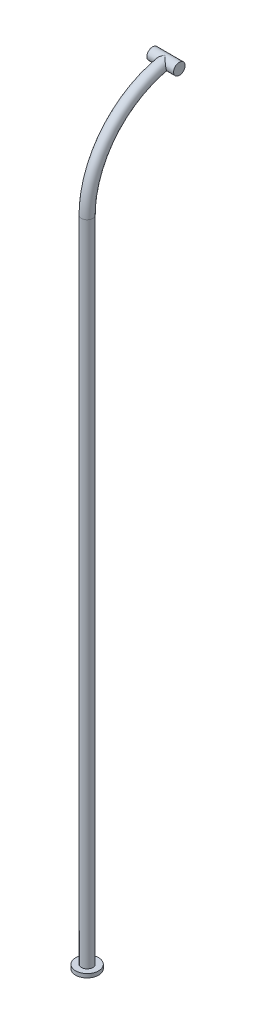
ISO-10303-21;
HEADER;
FILE_DESCRIPTION(('STEP AP214'),'2;1');
FILE_NAME('part.step','',(''),(''),'','','');
FILE_SCHEMA(('AUTOMOTIVE_DESIGN { 1 0 10303 214 1 1 1 1 }'));
ENDSEC;
DATA;
#1=APPLICATION_CONTEXT('core data for automotive mechanical design processes');
#2=APPLICATION_PROTOCOL_DEFINITION('international standard','automotive_design',2000,#1);
#3=PRODUCT_CONTEXT('',#1,'mechanical');
#4=PRODUCT('Part','Part','',(#3));
#5=PRODUCT_RELATED_PRODUCT_CATEGORY('part','',(#4));
#6=PRODUCT_DEFINITION_FORMATION('','',#4);
#7=PRODUCT_DEFINITION_CONTEXT('part definition',#1,'design');
#8=PRODUCT_DEFINITION('design','',#6,#7);
#9=PRODUCT_DEFINITION_SHAPE('','',#8);
#10=(LENGTH_UNIT() NAMED_UNIT(*) SI_UNIT(.MILLI.,.METRE.));
#11=(NAMED_UNIT(*) PLANE_ANGLE_UNIT() SI_UNIT($,.RADIAN.));
#12=(NAMED_UNIT(*) SI_UNIT($,.STERADIAN.) SOLID_ANGLE_UNIT());
#13=UNCERTAINTY_MEASURE_WITH_UNIT(LENGTH_MEASURE(1.E-05),#10,'distance_accuracy_value','');
#14=(GEOMETRIC_REPRESENTATION_CONTEXT(3) GLOBAL_UNCERTAINTY_ASSIGNED_CONTEXT((#13)) GLOBAL_UNIT_ASSIGNED_CONTEXT((#10,
#11,#12)) REPRESENTATION_CONTEXT('',''));
#15=CARTESIAN_POINT('',(0.,0.,0.));
#16=DIRECTION('',(0.,0.,1.));
#17=DIRECTION('',(1.,0.,0.));
#18=AXIS2_PLACEMENT_3D('',#15,#16,#17);
#19=CARTESIAN_POINT('',(0.,170.,0.));
#20=DIRECTION('',(0.,-1.,0.));
#21=DIRECTION('',(0.,0.,-1.));
#22=AXIS2_PLACEMENT_3D('',#19,#20,#21);
#23=CYLINDRICAL_SURFACE('',#22,1.5);
#24=CARTESIAN_POINT('',(0.,170.,0.));
#25=DIRECTION('',(0.,1.,0.));
#26=DIRECTION('',(0.,0.,1.));
#27=AXIS2_PLACEMENT_3D('',#24,#25,#26);
#28=CIRCLE('',#27,1.5);
#29=CARTESIAN_POINT('',(0.,170.,1.5));
#30=VERTEX_POINT('',#29);
#31=EDGE_CURVE('E11',#30,#30,#28,.T.);
#32=ORIENTED_EDGE('',*,*,#31,.F.);
#33=EDGE_LOOP('',(#32));
#34=FACE_BOUND('',#33,.T.);
#35=CARTESIAN_POINT('',(0.,0.,0.));
#36=DIRECTION('',(0.,1.,0.));
#37=DIRECTION('',(0.,0.,1.));
#38=AXIS2_PLACEMENT_3D('',#35,#36,#37);
#39=CIRCLE('',#38,1.5);
#40=CARTESIAN_POINT('',(0.,0.,1.5));
#41=VERTEX_POINT('',#40);
#42=EDGE_CURVE('E36',#41,#41,#39,.T.);
#43=ORIENTED_EDGE('',*,*,#42,.T.);
#44=EDGE_LOOP('',(#43));
#45=FACE_BOUND('',#44,.T.);
#46=ADVANCED_FACE('F33',(#34,#45),#23,.T.);
#47=CARTESIAN_POINT('',(0.,-1.,0.));
#48=DIRECTION('',(0.,1.,0.));
#49=DIRECTION('',(0.,0.,1.));
#50=AXIS2_PLACEMENT_3D('',#47,#48,#49);
#51=CYLINDRICAL_SURFACE('',#50,3.);
#52=CARTESIAN_POINT('',(0.,-1.,0.));
#53=DIRECTION('',(0.,-1.,0.));
#54=DIRECTION('',(0.,0.,-1.));
#55=AXIS2_PLACEMENT_3D('',#52,#53,#54);
#56=CIRCLE('',#55,3.);
#57=CARTESIAN_POINT('',(0.,-1.,-3.));
#58=VERTEX_POINT('',#57);
#59=EDGE_CURVE('E58',#58,#58,#56,.T.);
#60=ORIENTED_EDGE('',*,*,#59,.F.);
#61=EDGE_LOOP('',(#60));
#62=FACE_BOUND('',#61,.T.);
#63=CARTESIAN_POINT('',(0.,0.,0.));
#64=DIRECTION('',(0.,-1.,0.));
#65=DIRECTION('',(0.,0.,-1.));
#66=AXIS2_PLACEMENT_3D('',#63,#64,#65);
#67=CIRCLE('',#66,3.);
#68=CARTESIAN_POINT('',(0.,0.,-3.));
#69=VERTEX_POINT('',#68);
#70=EDGE_CURVE('E55',#69,#69,#67,.T.);
#71=ORIENTED_EDGE('',*,*,#70,.T.);
#72=EDGE_LOOP('',(#71));
#73=FACE_BOUND('',#72,.T.);
#74=ADVANCED_FACE('F88',(#62,#73),#51,.T.);
#75=CARTESIAN_POINT('',(0.,-1.,0.));
#76=DIRECTION('',(0.,-1.,0.));
#77=DIRECTION('',(0.,0.,-1.));
#78=AXIS2_PLACEMENT_3D('',#75,#76,#77);
#79=PLANE('',#78);
#80=ORIENTED_EDGE('',*,*,#59,.T.);
#81=EDGE_LOOP('',(#80));
#82=FACE_BOUND('',#81,.T.);
#83=ADVANCED_FACE('F93',(#82),#79,.T.);
#84=CARTESIAN_POINT('',(0.,0.,0.));
#85=DIRECTION('',(0.,-1.,0.));
#86=DIRECTION('',(0.,0.,-1.));
#87=AXIS2_PLACEMENT_3D('',#84,#85,#86);
#88=PLANE('',#87);
#89=ORIENTED_EDGE('',*,*,#42,.F.);
#90=EDGE_LOOP('',(#89));
#91=FACE_BOUND('',#90,.T.);
#92=ORIENTED_EDGE('',*,*,#70,.F.);
#93=EDGE_LOOP('',(#92));
#94=FACE_BOUND('',#93,.T.);
#95=ADVANCED_FACE('F106',(#91,#94),#88,.F.);
#96=CARTESIAN_POINT('',(0.,170.,-25.));
#97=DIRECTION('',(1.,0.,0.));
#98=DIRECTION('',(0.,0.,-1.));
#99=AXIS2_PLACEMENT_3D('',#96,#97,#98);
#100=TOROIDAL_SURFACE('',#99,25.,1.5);
#101=CARTESIAN_POINT('',(0.,196.097405454824,-20.3983232918264));
#102=CARTESIAN_POINT('',(-0.00185208502357919,196.097074329134,-20.396445424016));
#103=CARTESIAN_POINT('',(-0.00370422722976617,196.096739619365,-20.3945681283021));
#104=CARTESIAN_POINT('',(-0.116150210485304,196.076201917502,-20.2806333767581));
#105=CARTESIAN_POINT('',(-0.226920920672363,196.043225043147,-20.1706472365467));
#106=CARTESIAN_POINT('',(-0.445844221788012,195.951691985725,-19.958428819607));
#107=CARTESIAN_POINT('',(-0.553990345691901,195.893078289871,-19.8562145868425));
#108=CARTESIAN_POINT('',(-0.735813321106621,195.768599434473,-19.6898302938266));
#109=CARTESIAN_POINT('',(-0.811007045919244,195.708810378297,-19.6227727298704));
#110=CARTESIAN_POINT('',(-0.9556858362784,195.574540355294,-19.4979337913752));
#111=CARTESIAN_POINT('',(-1.0251831962087,195.5000922762,-19.4401321679718));
#112=CARTESIAN_POINT('',(-1.13852258345778,195.357469596793,-19.3505287060633));
#113=CARTESIAN_POINT('',(-1.18434554115618,195.292669982364,-19.3158710192436));
#114=CARTESIAN_POINT('',(-1.26935496083541,195.155036743513,-19.2553805896176));
#115=CARTESIAN_POINT('',(-1.30854973450321,195.082213373044,-19.2295367523219));
#116=CARTESIAN_POINT('',(-1.37081091307806,194.945183576589,-19.1930794683441));
#117=CARTESIAN_POINT('',(-1.39553649125644,194.882280335089,-19.180427867225));
#118=CARTESIAN_POINT('',(-1.43793040801549,194.753040551881,-19.1632722373921));
#119=CARTESIAN_POINT('',(-1.45560334392987,194.686706278689,-19.1587628942878));
#120=CARTESIAN_POINT('',(-1.48267117502225,194.551801765618,-19.1588287837281));
#121=CARTESIAN_POINT('',(-1.492003793121,194.483218604443,-19.1634715445826));
#122=CARTESIAN_POINT('',(-1.50122519844983,194.346738569284,-19.182327716068));
#123=CARTESIAN_POINT('',(-1.50111974116258,194.278841302298,-19.1965352886836));
#124=CARTESIAN_POINT('',(-1.49196724645287,194.154261217921,-19.23170373289));
#125=CARTESIAN_POINT('',(-1.48398992223417,194.097207689641,-19.2516550502028));
#126=CARTESIAN_POINT('',(-1.46115339764212,193.987089687611,-19.2976414144375));
#127=CARTESIAN_POINT('',(-1.44629325773508,193.934025759608,-19.3236772916873));
#128=CARTESIAN_POINT('',(-1.41004481256729,193.831483132902,-19.3814943712045));
#129=CARTESIAN_POINT('',(-1.38848810998103,193.782143283762,-19.4134139639274));
#130=CARTESIAN_POINT('',(-1.34007035426446,193.689200837202,-19.4812687772591));
#131=CARTESIAN_POINT('',(-1.31320676231024,193.645601002515,-19.5172059162821));
#132=CARTESIAN_POINT('',(-1.23937109051044,193.542036467106,-19.6124358732963));
#133=CARTESIAN_POINT('',(-1.18941419187053,193.486086662682,-19.6737916751274));
#134=CARTESIAN_POINT('',(-1.08230380225347,193.387264228387,-19.8006670218142));
#135=CARTESIAN_POINT('',(-1.02513113662405,193.344427523478,-19.8661974212589));
#136=CARTESIAN_POINT('',(-0.881280482061449,193.255547365387,-20.0268908230568));
#137=CARTESIAN_POINT('',(-0.792151643918254,193.215455148453,-20.1231381979125));
#138=CARTESIAN_POINT('',(-0.608341546467783,193.156254118854,-20.3165666265972));
#139=CARTESIAN_POINT('',(-0.513656907244478,193.137158221849,-20.4137482180689));
#140=CARTESIAN_POINT('',(-0.349783902286847,193.120777197883,-20.57856877472));
#141=CARTESIAN_POINT('',(-0.281290795060334,193.118727825155,-20.6464868801181));
#142=CARTESIAN_POINT('',(-0.143706031030469,193.123680389656,-20.7811920226528));
#143=CARTESIAN_POINT('',(-0.0746156366116799,193.130666437697,-20.8479808366561));
#144=CARTESIAN_POINT('',(-0.00370749109095252,193.142361194453,-20.915727326473));
#145=CARTESIAN_POINT('',(-0.0018537287437419,193.142670109625,-20.9174978717558));
#146=CARTESIAN_POINT('',(0.,193.142982195787,-20.9192678248272));
#147=B_SPLINE_CURVE_WITH_KNOTS('',3,(#101,#102,#103,#104,#105,#106,#107,#108,#109,#110,#111,
#112,#113,#114,#115,#116,#117,#118,#119,#120,#121,#122,#123,#124,#125,#126,#127,#128,#129,#130,
#131,#132,#133,#134,#135,#136,#137,#138,#139,#140,#141,#142,#143,#144,#145,#146),.UNSPECIFIED.,
.F.,.F.,(4,2,2,2,2,2,2,2,2,2,2,2,2,2,2,2,2,2,2,2,2,2,4),(0.,0.00797496827588741,
0.484157815087235,0.961414438019249,1.31172150254955,1.6612514234147,1.92019071401984,
2.17880284960823,2.38428697071424,2.58963692533016,2.79650771540656,3.00325235337244,
3.18529819109025,3.36736888616845,3.55445005670501,3.74162094484777,4.0307008229257,
4.32056572600409,4.72986529209054,5.13941649377024,5.42846469434474,5.71700528131039,
5.72475125406472),.UNSPECIFIED.);
#148=CARTESIAN_POINT('',(0.,196.097405454824,-20.3983232918264));
#149=VERTEX_POINT('',#148);
#150=CARTESIAN_POINT('',(0.,193.142982195787,-20.9192678248272));
#151=VERTEX_POINT('',#150);
#152=EDGE_CURVE('E48',#149,#151,#147,.T.);
#153=ORIENTED_EDGE('',*,*,#152,.T.);
#154=CARTESIAN_POINT('',(0.,193.142982195787,-20.9192678248272));
#155=CARTESIAN_POINT('',(0.00185368422650866,193.142670122991,-20.9174979132987));
#156=CARTESIAN_POINT('',(0.00370744689531109,193.142361207552,-20.9157273677468));
#157=CARTESIAN_POINT('',(0.125678840899784,193.12224429608,-20.7991945026577));
#158=CARTESIAN_POINT('',(0.24608963565472,193.115700843209,-20.6817994816205));
#159=CARTESIAN_POINT('',(0.42382507875506,193.126986268824,-20.5043385498017));
#160=CARTESIAN_POINT('',(0.482680378254115,193.134293032157,-20.4448622235837));
#161=CARTESIAN_POINT('',(0.598884273242413,193.156364291169,-20.3258367634685));
#162=CARTESIAN_POINT('',(0.656233819136842,193.171123957566,-20.2662877015967));
#163=CARTESIAN_POINT('',(0.786433790459133,193.214499627108,-20.1289647910036));
#164=CARTESIAN_POINT('',(0.858502828466832,193.246009983011,-20.051334264527));
#165=CARTESIAN_POINT('',(0.996655310348563,193.32427718139,-19.8985714067522));
#166=CARTESIAN_POINT('',(1.06275190416424,193.370999431424,-19.8234338296053));
#167=CARTESIAN_POINT('',(1.1704728992213,193.467551984641,-19.6964627168362));
#168=CARTESIAN_POINT('',(1.21408008432645,193.51367212516,-19.6435062921142));
#169=CARTESIAN_POINT('',(1.29435263042139,193.616001734901,-19.5422106875578));
#170=CARTESIAN_POINT('',(1.33102669295197,193.672198382388,-19.4938657582695));
#171=CARTESIAN_POINT('',(1.38877991266708,193.782428785845,-19.4130643043434));
#172=CARTESIAN_POINT('',(1.41150979646465,193.834674104967,-19.3793594050381));
#173=CARTESIAN_POINT('',(1.44978994236094,193.944986027012,-19.3178738868188));
#174=CARTESIAN_POINT('',(1.46534533102236,194.003048437088,-19.2900890453671));
#175=CARTESIAN_POINT('',(1.48829350276191,194.124065150002,-19.2417129634967));
#176=CARTESIAN_POINT('',(1.49563811014042,194.187046028898,-19.2211646593041));
#177=CARTESIAN_POINT('',(1.50146545762153,194.315565099987,-19.1885602626892));
#178=CARTESIAN_POINT('',(1.49995017894568,194.381102717194,-19.1765022723636));
#179=CARTESIAN_POINT('',(1.4888556487141,194.506255912528,-19.161926737758));
#180=CARTESIAN_POINT('',(1.48004255151481,194.565853068941,-19.1586235134003));
#181=CARTESIAN_POINT('',(1.45599910715938,194.683693269741,-19.1589815834111));
#182=CARTESIAN_POINT('',(1.44076767487405,194.741936083396,-19.1626440558177));
#183=CARTESIAN_POINT('',(1.40366106932152,194.859406715525,-19.1767388327648));
#184=CARTESIAN_POINT('',(1.38143307432315,194.918472426987,-19.1875760705597));
#185=CARTESIAN_POINT('',(1.33186400110102,195.032841367826,-19.2154680786807));
#186=CARTESIAN_POINT('',(1.30451995992293,195.088142391446,-19.2325264574377));
#187=CARTESIAN_POINT('',(1.2297335781643,195.223427326213,-19.2826519164483));
#188=CARTESIAN_POINT('',(1.17944464330685,195.300492315382,-19.319380914789));
#189=CARTESIAN_POINT('',(1.07202531596892,195.443956400964,-19.4024828586349));
#190=CARTESIAN_POINT('',(1.01487800606143,195.510328136126,-19.4488798683432));
#191=CARTESIAN_POINT('',(0.874785901371617,195.654076142555,-19.5667679466092));
#192=CARTESIAN_POINT('',(0.789876265160044,195.727015875864,-19.6413248504446));
#193=CARTESIAN_POINT('',(0.615018697936113,195.854058236435,-19.7997836777994));
#194=CARTESIAN_POINT('',(0.525067931259113,195.908150135685,-19.8836908876854));
#195=CARTESIAN_POINT('',(0.363408714895986,195.987797950301,-20.0380118197251));
#196=CARTESIAN_POINT('',(0.292232779716389,196.01705080203,-20.107123089907));
#197=CARTESIAN_POINT('',(0.149205823842906,196.064785292849,-20.2480903602351));
#198=CARTESIAN_POINT('',(0.0773563385436778,196.083287244127,-20.3199409093051));
#199=CARTESIAN_POINT('',(0.00370424379479962,196.096739621032,-20.3945681106039));
#200=CARTESIAN_POINT('',(0.00185210151386733,196.097074330998,-20.3964454063588));
#201=CARTESIAN_POINT('',(0.,196.097405454824,-20.3983232918264));
#202=B_SPLINE_CURVE_WITH_KNOTS('',3,(#154,#155,#156,#157,#158,#159,#160,#161,#162,#163,#164,
#165,#166,#167,#168,#169,#170,#171,#172,#173,#174,#175,#176,#177,#178,#179,#180,#181,#182,#183,
#184,#185,#186,#187,#188,#189,#190,#191,#192,#193,#194,#195,#196,#197,#198,#199,#200,#201),
.UNSPECIFIED.,.F.,.F.,(4,2,2,2,2,2,2,2,2,2,2,2,2,2,2,2,2,2,2,2,2,2,2,4),(0.,0.00774597275432808,
0.509639941714782,0.761379956448416,1.01295705930891,1.34345853007765,1.6732136164904,
1.92036800764369,2.16721011336464,2.36501124336377,2.56267081400468,2.76148413753281,
2.96025300471352,3.14046255904503,3.32070259311157,3.51209702589732,3.70360264967958,
3.99918389078214,4.29550983099461,4.69685613537337,5.09843051060698,5.40816876499296,
5.7173198972066,5.72529486548248),.UNSPECIFIED.);
#203=EDGE_CURVE('E46',#151,#149,#202,.T.);
#204=ORIENTED_EDGE('',*,*,#203,.T.);
#205=EDGE_LOOP('',(#153,#204));
#206=FACE_BOUND('',#205,.T.);
#207=ORIENTED_EDGE('',*,*,#31,.T.);
#208=EDGE_LOOP('',(#207));
#209=FACE_BOUND('',#208,.T.);
#210=ADVANCED_FACE('F53',(#206,#209),#100,.T.);
#211=CARTESIAN_POINT('',(-3.5,194.620193825305,-20.6587955583268));
#212=DIRECTION('',(1.,0.,0.));
#213=DIRECTION('',(0.,0.,-1.));
#214=AXIS2_PLACEMENT_3D('',#211,#212,#213);
#215=CYLINDRICAL_SURFACE('',#214,1.5);
#216=CARTESIAN_POINT('',(3.5,194.620193825305,-20.6587955583268));
#217=DIRECTION('',(1.,0.,0.));
#218=DIRECTION('',(0.,0.,-1.));
#219=AXIS2_PLACEMENT_3D('',#216,#217,#218);
#220=CIRCLE('',#219,1.5);
#221=CARTESIAN_POINT('',(3.5,194.620193825305,-22.1587955583268));
#222=VERTEX_POINT('',#221);
#223=EDGE_CURVE('E156',#222,#222,#220,.T.);
#224=ORIENTED_EDGE('',*,*,#223,.F.);
#225=EDGE_LOOP('',(#224));
#226=FACE_BOUND('',#225,.T.);
#227=CARTESIAN_POINT('',(-3.5,194.620193825305,-20.6587955583268));
#228=DIRECTION('',(1.,0.,0.));
#229=DIRECTION('',(0.,0.,-1.));
#230=AXIS2_PLACEMENT_3D('',#227,#228,#229);
#231=CIRCLE('',#230,1.5);
#232=CARTESIAN_POINT('',(-3.5,194.620193825305,-22.1587955583268));
#233=VERTEX_POINT('',#232);
#234=EDGE_CURVE('E51',#233,#233,#231,.T.);
#235=ORIENTED_EDGE('',*,*,#234,.T.);
#236=EDGE_LOOP('',(#235));
#237=FACE_BOUND('',#236,.T.);
#238=ORIENTED_EDGE('',*,*,#203,.F.);
#239=ORIENTED_EDGE('',*,*,#152,.F.);
#240=EDGE_LOOP('',(#238,#239));
#241=FACE_BOUND('',#240,.T.);
#242=ADVANCED_FACE('F49',(#226,#237,#241),#215,.T.);
#243=CARTESIAN_POINT('',(-3.5,194.620193825305,-20.6587955583268));
#244=DIRECTION('',(1.,0.,0.));
#245=DIRECTION('',(0.,0.,-1.));
#246=AXIS2_PLACEMENT_3D('',#243,#244,#245);
#247=PLANE('',#246);
#248=ORIENTED_EDGE('',*,*,#234,.F.);
#249=EDGE_LOOP('',(#248));
#250=FACE_BOUND('',#249,.T.);
#251=ADVANCED_FACE('F75',(#250),#247,.F.);
#252=CARTESIAN_POINT('',(3.5,194.620193825305,-20.6587955583268));
#253=DIRECTION('',(1.,0.,0.));
#254=DIRECTION('',(0.,0.,-1.));
#255=AXIS2_PLACEMENT_3D('',#252,#253,#254);
#256=PLANE('',#255);
#257=ORIENTED_EDGE('',*,*,#223,.T.);
#258=EDGE_LOOP('',(#257));
#259=FACE_BOUND('',#258,.T.);
#260=ADVANCED_FACE('F80',(#259),#256,.T.);
#261=CLOSED_SHELL('',(#46,#74,#83,#95,#210,#242,#251,#260));
#262=MANIFOLD_SOLID_BREP('B2',#261);
#263=ADVANCED_BREP_SHAPE_REPRESENTATION('',(#18,#262),#14);
#264=SHAPE_DEFINITION_REPRESENTATION(#9,#263);
ENDSEC;
END-ISO-10303-21;
